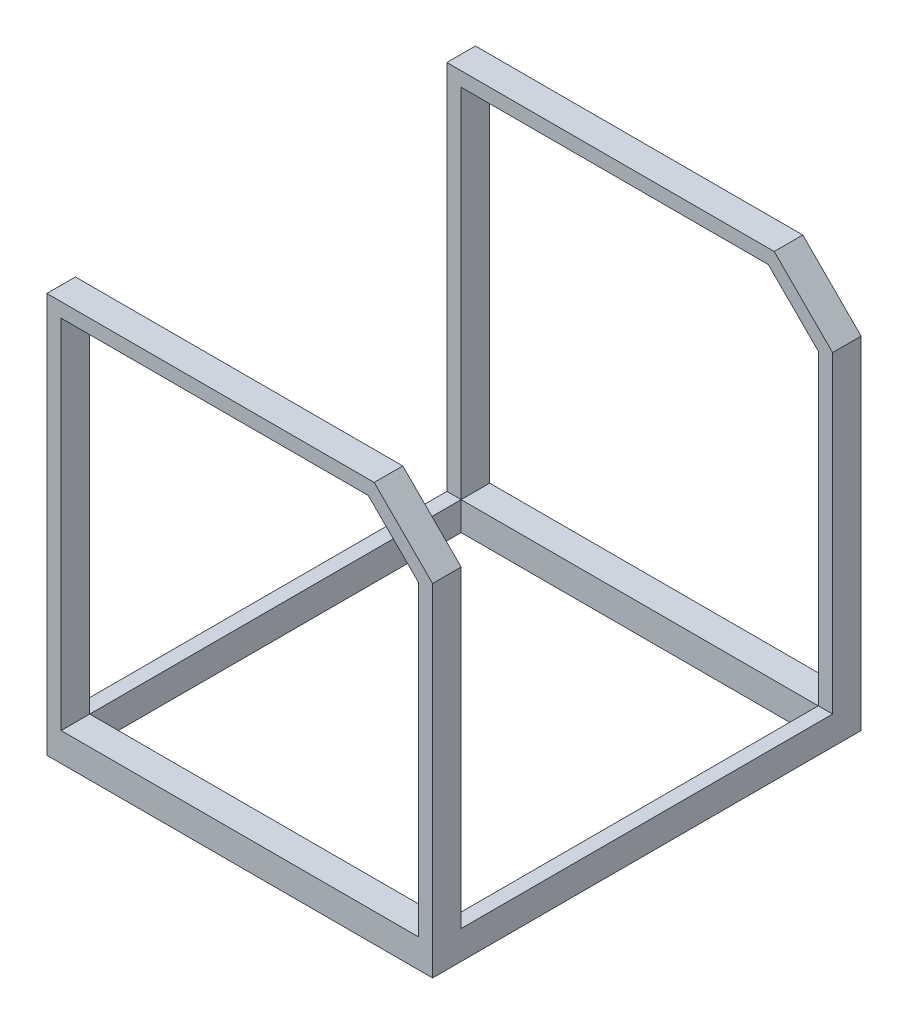
ISO-10303-21;
HEADER;
FILE_DESCRIPTION(('STEP AP214'),'2;1');
FILE_NAME('part.step','',(''),(''),'','','');
FILE_SCHEMA(('AUTOMOTIVE_DESIGN { 1 0 10303 214 1 1 1 1 }'));
ENDSEC;
DATA;
#1=APPLICATION_CONTEXT('core data for automotive mechanical design processes');
#2=APPLICATION_PROTOCOL_DEFINITION('international standard','automotive_design',2000,#1);
#3=PRODUCT_CONTEXT('',#1,'mechanical');
#4=PRODUCT('Part','Part','',(#3));
#5=PRODUCT_RELATED_PRODUCT_CATEGORY('part','',(#4));
#6=PRODUCT_DEFINITION_FORMATION('','',#4);
#7=PRODUCT_DEFINITION_CONTEXT('part definition',#1,'design');
#8=PRODUCT_DEFINITION('design','',#6,#7);
#9=PRODUCT_DEFINITION_SHAPE('','',#8);
#10=(LENGTH_UNIT() NAMED_UNIT(*) SI_UNIT(.MILLI.,.METRE.));
#11=(NAMED_UNIT(*) PLANE_ANGLE_UNIT() SI_UNIT($,.RADIAN.));
#12=(NAMED_UNIT(*) SI_UNIT($,.STERADIAN.) SOLID_ANGLE_UNIT());
#13=UNCERTAINTY_MEASURE_WITH_UNIT(LENGTH_MEASURE(1.E-05),#10,'distance_accuracy_value','');
#14=(GEOMETRIC_REPRESENTATION_CONTEXT(3) GLOBAL_UNCERTAINTY_ASSIGNED_CONTEXT((#13)) GLOBAL_UNIT_ASSIGNED_CONTEXT((#10,
#11,#12)) REPRESENTATION_CONTEXT('',''));
#15=CARTESIAN_POINT('',(0.,0.,0.));
#16=DIRECTION('',(0.,0.,1.));
#17=DIRECTION('',(1.,0.,0.));
#18=AXIS2_PLACEMENT_3D('',#15,#16,#17);
#19=CARTESIAN_POINT('',(0.,0.,40.));
#20=DIRECTION('',(0.,0.,-1.));
#21=DIRECTION('',(-1.,0.,0.));
#22=AXIS2_PLACEMENT_3D('',#19,#20,#21);
#23=PLANE('',#22);
#24=DIRECTION('',(0.,1.,0.));
#25=VECTOR('',#24,1.);
#26=CARTESIAN_POINT('',(20.,0.,40.));
#27=LINE('',#26,#25);
#28=CARTESIAN_POINT('',(20.,0.,40.));
#29=VERTEX_POINT('',#28);
#30=CARTESIAN_POINT('',(20.,39.9999999999999,40.));
#31=VERTEX_POINT('',#30);
#32=EDGE_CURVE('E47',#29,#31,#27,.T.);
#33=ORIENTED_EDGE('',*,*,#32,.F.);
#34=DIRECTION('',(1.,0.,0.));
#35=VECTOR('',#34,1.);
#36=CARTESIAN_POINT('',(540.,0.,40.));
#37=LINE('',#36,#35);
#38=CARTESIAN_POINT('',(520.,0.,40.));
#39=VERTEX_POINT('',#38);
#40=EDGE_CURVE('E347',#29,#39,#37,.T.);
#41=ORIENTED_EDGE('',*,*,#40,.T.);
#42=DIRECTION('',(0.,-1.,0.));
#43=VECTOR('',#42,1.);
#44=CARTESIAN_POINT('',(520.,0.,40.));
#45=LINE('',#44,#43);
#46=CARTESIAN_POINT('',(520.,40.,40.));
#47=VERTEX_POINT('',#46);
#48=EDGE_CURVE('E290',#47,#39,#45,.T.);
#49=ORIENTED_EDGE('',*,*,#48,.F.);
#50=DIRECTION('',(1.,0.,0.));
#51=VECTOR('',#50,1.);
#52=CARTESIAN_POINT('',(520.,40.,40.));
#53=LINE('',#52,#51);
#54=EDGE_CURVE('E307',#31,#47,#53,.T.);
#55=ORIENTED_EDGE('',*,*,#54,.F.);
#56=EDGE_LOOP('',(#33,#41,#49,#55));
#57=FACE_BOUND('',#56,.T.);
#58=ADVANCED_FACE('F32',(#57),#23,.F.);
#59=DIRECTION('',(-1.,0.,0.));
#60=VECTOR('',#59,1.);
#61=CARTESIAN_POINT('',(0.,39.9999999999999,40.));
#62=LINE('',#61,#60);
#63=CARTESIAN_POINT('',(0.,39.9999999999999,40.));
#64=VERTEX_POINT('',#63);
#65=EDGE_CURVE('E272',#31,#64,#62,.T.);
#66=ORIENTED_EDGE('',*,*,#65,.F.);
#67=DIRECTION('',(0.,-1.,0.));
#68=VECTOR('',#67,1.);
#69=CARTESIAN_POINT('',(20.,39.9999999999999,40.));
#70=LINE('',#69,#68);
#71=CARTESIAN_POINT('',(20.,540.,40.));
#72=VERTEX_POINT('',#71);
#73=EDGE_CURVE('E318',#72,#31,#70,.T.);
#74=ORIENTED_EDGE('',*,*,#73,.F.);
#75=DIRECTION('',(-1.,0.,0.));
#76=VECTOR('',#75,1.);
#77=CARTESIAN_POINT('',(20.,540.,40.));
#78=LINE('',#77,#76);
#79=CARTESIAN_POINT('',(450.,540.,40.));
#80=VERTEX_POINT('',#79);
#81=EDGE_CURVE('E315',#80,#72,#78,.T.);
#82=ORIENTED_EDGE('',*,*,#81,.F.);
#83=DIRECTION('',(-0.707106781186548,0.707106781186548,0.));
#84=VECTOR('',#83,1.);
#85=CARTESIAN_POINT('',(450.,540.,40.));
#86=LINE('',#85,#84);
#87=CARTESIAN_POINT('',(520.,470.,40.));
#88=VERTEX_POINT('',#87);
#89=EDGE_CURVE('E313',#88,#80,#86,.T.);
#90=ORIENTED_EDGE('',*,*,#89,.F.);
#91=DIRECTION('',(0.,1.,0.));
#92=VECTOR('',#91,1.);
#93=CARTESIAN_POINT('',(520.,470.,40.));
#94=LINE('',#93,#92);
#95=EDGE_CURVE('E310',#47,#88,#94,.T.);
#96=ORIENTED_EDGE('',*,*,#95,.F.);
#97=DIRECTION('',(-1.,0.,0.));
#98=VECTOR('',#97,1.);
#99=CARTESIAN_POINT('',(540.,40.,40.));
#100=LINE('',#99,#98);
#101=CARTESIAN_POINT('',(540.,40.0000000000001,40.));
#102=VERTEX_POINT('',#101);
#103=EDGE_CURVE('E285',#102,#47,#100,.T.);
#104=ORIENTED_EDGE('',*,*,#103,.F.);
#105=DIRECTION('',(0.,1.,0.));
#106=VECTOR('',#105,1.);
#107=CARTESIAN_POINT('',(540.,478.284271247462,40.));
#108=LINE('',#107,#106);
#109=CARTESIAN_POINT('',(540.,478.284271247462,40.));
#110=VERTEX_POINT('',#109);
#111=EDGE_CURVE('E349',#102,#110,#108,.T.);
#112=ORIENTED_EDGE('',*,*,#111,.T.);
#113=DIRECTION('',(-0.707106781186547,0.707106781186548,0.));
#114=VECTOR('',#113,1.);
#115=CARTESIAN_POINT('',(458.284271247462,560.,40.));
#116=LINE('',#115,#114);
#117=CARTESIAN_POINT('',(458.284271247462,560.,40.));
#118=VERTEX_POINT('',#117);
#119=EDGE_CURVE('E352',#110,#118,#116,.T.);
#120=ORIENTED_EDGE('',*,*,#119,.T.);
#121=DIRECTION('',(-1.,0.,0.));
#122=VECTOR('',#121,1.);
#123=CARTESIAN_POINT('',(0.,560.,40.));
#124=LINE('',#123,#122);
#125=CARTESIAN_POINT('',(0.,560.,40.));
#126=VERTEX_POINT('',#125);
#127=EDGE_CURVE('E354',#118,#126,#124,.T.);
#128=ORIENTED_EDGE('',*,*,#127,.T.);
#129=DIRECTION('',(0.,-1.,0.));
#130=VECTOR('',#129,1.);
#131=CARTESIAN_POINT('',(0.,0.,40.));
#132=LINE('',#131,#130);
#133=EDGE_CURVE('E55',#126,#64,#132,.T.);
#134=ORIENTED_EDGE('',*,*,#133,.T.);
#135=EDGE_LOOP('',(#66,#74,#82,#90,#96,#104,#112,#120,#128,#134));
#136=FACE_BOUND('',#135,.T.);
#137=ADVANCED_FACE('F435',(#136),#23,.F.);
#138=CARTESIAN_POINT('',(0.,0.,0.));
#139=DIRECTION('',(0.,0.,-1.));
#140=DIRECTION('',(-1.,0.,0.));
#141=AXIS2_PLACEMENT_3D('',#138,#139,#140);
#142=PLANE('',#141);
#143=DIRECTION('',(1.,0.,0.));
#144=VECTOR('',#143,1.);
#145=CARTESIAN_POINT('',(540.,0.,0.));
#146=LINE('',#145,#144);
#147=CARTESIAN_POINT('',(0.,0.,0.));
#148=VERTEX_POINT('',#147);
#149=CARTESIAN_POINT('',(540.,0.,0.));
#150=VERTEX_POINT('',#149);
#151=EDGE_CURVE('E346',#148,#150,#146,.T.);
#152=ORIENTED_EDGE('',*,*,#151,.F.);
#153=DIRECTION('',(0.,-1.,0.));
#154=VECTOR('',#153,1.);
#155=CARTESIAN_POINT('',(0.,0.,0.));
#156=LINE('',#155,#154);
#157=CARTESIAN_POINT('',(0.,560.,0.));
#158=VERTEX_POINT('',#157);
#159=EDGE_CURVE('E350',#158,#148,#156,.T.);
#160=ORIENTED_EDGE('',*,*,#159,.F.);
#161=DIRECTION('',(-1.,0.,0.));
#162=VECTOR('',#161,1.);
#163=CARTESIAN_POINT('',(0.,560.,0.));
#164=LINE('',#163,#162);
#165=CARTESIAN_POINT('',(458.284271247462,560.,0.));
#166=VERTEX_POINT('',#165);
#167=EDGE_CURVE('E364',#166,#158,#164,.T.);
#168=ORIENTED_EDGE('',*,*,#167,.F.);
#169=DIRECTION('',(-0.707106781186547,0.707106781186548,0.));
#170=VECTOR('',#169,1.);
#171=CARTESIAN_POINT('',(458.284271247462,560.,0.));
#172=LINE('',#171,#170);
#173=CARTESIAN_POINT('',(540.,478.284271247462,0.));
#174=VERTEX_POINT('',#173);
#175=EDGE_CURVE('E362',#174,#166,#172,.T.);
#176=ORIENTED_EDGE('',*,*,#175,.F.);
#177=DIRECTION('',(0.,1.,0.));
#178=VECTOR('',#177,1.);
#179=CARTESIAN_POINT('',(540.,478.284271247462,0.));
#180=LINE('',#179,#178);
#181=EDGE_CURVE('E360',#150,#174,#180,.T.);
#182=ORIENTED_EDGE('',*,*,#181,.F.);
#183=EDGE_LOOP('',(#152,#160,#168,#176,#182));
#184=FACE_BOUND('',#183,.T.);
#185=DIRECTION('',(0.,-1.,0.));
#186=VECTOR('',#185,1.);
#187=CARTESIAN_POINT('',(20.,39.9999999999999,0.));
#188=LINE('',#187,#186);
#189=CARTESIAN_POINT('',(20.,540.,0.));
#190=VERTEX_POINT('',#189);
#191=CARTESIAN_POINT('',(20.,39.9999999999999,0.));
#192=VERTEX_POINT('',#191);
#193=EDGE_CURVE('E311',#190,#192,#188,.T.);
#194=ORIENTED_EDGE('',*,*,#193,.T.);
#195=DIRECTION('',(1.,0.,0.));
#196=VECTOR('',#195,1.);
#197=CARTESIAN_POINT('',(520.,40.,0.));
#198=LINE('',#197,#196);
#199=CARTESIAN_POINT('',(520.,40.,0.));
#200=VERTEX_POINT('',#199);
#201=EDGE_CURVE('E306',#192,#200,#198,.T.);
#202=ORIENTED_EDGE('',*,*,#201,.T.);
#203=DIRECTION('',(0.,1.,0.));
#204=VECTOR('',#203,1.);
#205=CARTESIAN_POINT('',(520.,470.,0.));
#206=LINE('',#205,#204);
#207=CARTESIAN_POINT('',(520.,470.,0.));
#208=VERTEX_POINT('',#207);
#209=EDGE_CURVE('E324',#200,#208,#206,.T.);
#210=ORIENTED_EDGE('',*,*,#209,.T.);
#211=DIRECTION('',(-0.707106781186548,0.707106781186548,0.));
#212=VECTOR('',#211,1.);
#213=CARTESIAN_POINT('',(450.,540.,0.));
#214=LINE('',#213,#212);
#215=CARTESIAN_POINT('',(450.,540.,0.));
#216=VERTEX_POINT('',#215);
#217=EDGE_CURVE('E327',#208,#216,#214,.T.);
#218=ORIENTED_EDGE('',*,*,#217,.T.);
#219=DIRECTION('',(-1.,0.,0.));
#220=VECTOR('',#219,1.);
#221=CARTESIAN_POINT('',(20.,540.,0.));
#222=LINE('',#221,#220);
#223=EDGE_CURVE('E330',#216,#190,#222,.T.);
#224=ORIENTED_EDGE('',*,*,#223,.T.);
#225=EDGE_LOOP('',(#194,#202,#210,#218,#224));
#226=FACE_BOUND('',#225,.T.);
#227=ADVANCED_FACE('F386',(#184,#226),#142,.T.);
#228=CARTESIAN_POINT('',(540.,0.,40.));
#229=DIRECTION('',(0.,1.,0.));
#230=DIRECTION('',(-1.,0.,0.));
#231=AXIS2_PLACEMENT_3D('',#228,#229,#230);
#232=PLANE('',#231);
#233=DIRECTION('',(0.,0.,-1.));
#234=VECTOR('',#233,1.);
#235=CARTESIAN_POINT('',(540.,0.,40.));
#236=LINE('',#235,#234);
#237=CARTESIAN_POINT('',(540.,0.,600.));
#238=VERTEX_POINT('',#237);
#239=EDGE_CURVE('E11',#238,#150,#236,.T.);
#240=ORIENTED_EDGE('',*,*,#239,.F.);
#241=DIRECTION('',(1.,0.,0.));
#242=VECTOR('',#241,1.);
#243=CARTESIAN_POINT('',(540.,0.,600.));
#244=LINE('',#243,#242);
#245=CARTESIAN_POINT('',(0.,0.,600.));
#246=VERTEX_POINT('',#245);
#247=EDGE_CURVE('E233',#246,#238,#244,.T.);
#248=ORIENTED_EDGE('',*,*,#247,.F.);
#249=DIRECTION('',(0.,0.,-1.));
#250=VECTOR('',#249,1.);
#251=CARTESIAN_POINT('',(0.,0.,40.));
#252=LINE('',#251,#250);
#253=EDGE_CURVE('E357',#246,#148,#252,.T.);
#254=ORIENTED_EDGE('',*,*,#253,.T.);
#255=ORIENTED_EDGE('',*,*,#151,.T.);
#256=EDGE_LOOP('',(#240,#248,#254,#255));
#257=FACE_BOUND('',#256,.T.);
#258=DIRECTION('',(1.,0.,0.));
#259=VECTOR('',#258,1.);
#260=CARTESIAN_POINT('',(540.,0.,560.));
#261=LINE('',#260,#259);
#262=CARTESIAN_POINT('',(20.,0.,560.));
#263=VERTEX_POINT('',#262);
#264=CARTESIAN_POINT('',(520.,0.,560.));
#265=VERTEX_POINT('',#264);
#266=EDGE_CURVE('E234',#263,#265,#261,.T.);
#267=ORIENTED_EDGE('',*,*,#266,.T.);
#268=DIRECTION('',(0.,0.,-1.));
#269=VECTOR('',#268,1.);
#270=CARTESIAN_POINT('',(520.,0.,560.));
#271=LINE('',#270,#269);
#272=EDGE_CURVE('E293',#265,#39,#271,.T.);
#273=ORIENTED_EDGE('',*,*,#272,.T.);
#274=ORIENTED_EDGE('',*,*,#40,.F.);
#275=DIRECTION('',(0.,0.,-1.));
#276=VECTOR('',#275,1.);
#277=CARTESIAN_POINT('',(20.,0.,560.));
#278=LINE('',#277,#276);
#279=EDGE_CURVE('E282',#263,#29,#278,.T.);
#280=ORIENTED_EDGE('',*,*,#279,.F.);
#281=EDGE_LOOP('',(#267,#273,#274,#280));
#282=FACE_BOUND('',#281,.T.);
#283=ADVANCED_FACE('F34',(#257,#282),#232,.F.);
#284=CARTESIAN_POINT('',(540.,478.284271247462,40.));
#285=DIRECTION('',(-1.,0.,0.));
#286=DIRECTION('',(0.,-1.,0.));
#287=AXIS2_PLACEMENT_3D('',#284,#285,#286);
#288=PLANE('',#287);
#289=ORIENTED_EDGE('',*,*,#181,.T.);
#290=DIRECTION('',(0.,0.,-1.));
#291=VECTOR('',#290,1.);
#292=CARTESIAN_POINT('',(540.,478.284271247462,40.));
#293=LINE('',#292,#291);
#294=EDGE_CURVE('E40',#110,#174,#293,.T.);
#295=ORIENTED_EDGE('',*,*,#294,.F.);
#296=ORIENTED_EDGE('',*,*,#111,.F.);
#297=DIRECTION('',(0.,0.,-1.));
#298=VECTOR('',#297,1.);
#299=CARTESIAN_POINT('',(540.,40.,560.));
#300=LINE('',#299,#298);
#301=CARTESIAN_POINT('',(540.,40.0000000000001,560.));
#302=VERTEX_POINT('',#301);
#303=EDGE_CURVE('E303',#302,#102,#300,.T.);
#304=ORIENTED_EDGE('',*,*,#303,.F.);
#305=DIRECTION('',(0.,1.,0.));
#306=VECTOR('',#305,1.);
#307=CARTESIAN_POINT('',(540.,478.284271247462,560.));
#308=LINE('',#307,#306);
#309=CARTESIAN_POINT('',(540.,478.284271247462,560.));
#310=VERTEX_POINT('',#309);
#311=EDGE_CURVE('E247',#302,#310,#308,.T.);
#312=ORIENTED_EDGE('',*,*,#311,.T.);
#313=DIRECTION('',(0.,0.,1.));
#314=VECTOR('',#313,1.);
#315=CARTESIAN_POINT('',(540.,478.284271247462,560.));
#316=LINE('',#315,#314);
#317=CARTESIAN_POINT('',(540.,478.284271247462,600.));
#318=VERTEX_POINT('',#317);
#319=EDGE_CURVE('E249',#310,#318,#316,.T.);
#320=ORIENTED_EDGE('',*,*,#319,.T.);
#321=DIRECTION('',(0.,1.,0.));
#322=VECTOR('',#321,1.);
#323=CARTESIAN_POINT('',(540.,478.284271247462,600.));
#324=LINE('',#323,#322);
#325=EDGE_CURVE('E238',#238,#318,#324,.T.);
#326=ORIENTED_EDGE('',*,*,#325,.F.);
#327=ORIENTED_EDGE('',*,*,#239,.T.);
#328=EDGE_LOOP('',(#289,#295,#296,#304,#312,#320,#326,#327));
#329=FACE_BOUND('',#328,.T.);
#330=ADVANCED_FACE('F411',(#329),#288,.F.);
#331=CARTESIAN_POINT('',(458.284271247462,560.,40.));
#332=DIRECTION('',(-0.707106781186548,-0.707106781186547,0.));
#333=DIRECTION('',(0.707106781186547,-0.707106781186548,0.));
#334=AXIS2_PLACEMENT_3D('',#331,#332,#333);
#335=PLANE('',#334);
#336=ORIENTED_EDGE('',*,*,#175,.T.);
#337=DIRECTION('',(0.,0.,-1.));
#338=VECTOR('',#337,1.);
#339=CARTESIAN_POINT('',(458.284271247462,560.,40.));
#340=LINE('',#339,#338);
#341=EDGE_CURVE('E372',#118,#166,#340,.T.);
#342=ORIENTED_EDGE('',*,*,#341,.F.);
#343=ORIENTED_EDGE('',*,*,#119,.F.);
#344=ORIENTED_EDGE('',*,*,#294,.T.);
#345=EDGE_LOOP('',(#336,#342,#343,#344));
#346=FACE_BOUND('',#345,.T.);
#347=ADVANCED_FACE('F379',(#346),#335,.F.);
#348=CARTESIAN_POINT('',(0.,560.,40.));
#349=DIRECTION('',(0.,-1.,0.));
#350=DIRECTION('',(0.,0.,-1.));
#351=AXIS2_PLACEMENT_3D('',#348,#349,#350);
#352=PLANE('',#351);
#353=ORIENTED_EDGE('',*,*,#167,.T.);
#354=DIRECTION('',(0.,0.,-1.));
#355=VECTOR('',#354,1.);
#356=CARTESIAN_POINT('',(0.,560.,40.));
#357=LINE('',#356,#355);
#358=EDGE_CURVE('E369',#126,#158,#357,.T.);
#359=ORIENTED_EDGE('',*,*,#358,.F.);
#360=ORIENTED_EDGE('',*,*,#127,.F.);
#361=ORIENTED_EDGE('',*,*,#341,.T.);
#362=EDGE_LOOP('',(#353,#359,#360,#361));
#363=FACE_BOUND('',#362,.T.);
#364=ADVANCED_FACE('F391',(#363),#352,.F.);
#365=CARTESIAN_POINT('',(0.,0.,40.));
#366=DIRECTION('',(1.,0.,0.));
#367=DIRECTION('',(0.,0.,-1.));
#368=AXIS2_PLACEMENT_3D('',#365,#366,#367);
#369=PLANE('',#368);
#370=ORIENTED_EDGE('',*,*,#159,.T.);
#371=ORIENTED_EDGE('',*,*,#253,.F.);
#372=DIRECTION('',(0.,-1.,0.));
#373=VECTOR('',#372,1.);
#374=CARTESIAN_POINT('',(0.,0.,600.));
#375=LINE('',#374,#373);
#376=CARTESIAN_POINT('',(0.,560.,600.));
#377=VERTEX_POINT('',#376);
#378=EDGE_CURVE('E252',#377,#246,#375,.T.);
#379=ORIENTED_EDGE('',*,*,#378,.F.);
#380=DIRECTION('',(0.,0.,1.));
#381=VECTOR('',#380,1.);
#382=CARTESIAN_POINT('',(0.,560.,560.));
#383=LINE('',#382,#381);
#384=CARTESIAN_POINT('',(0.,560.,560.));
#385=VERTEX_POINT('',#384);
#386=EDGE_CURVE('E266',#385,#377,#383,.T.);
#387=ORIENTED_EDGE('',*,*,#386,.F.);
#388=DIRECTION('',(0.,-1.,0.));
#389=VECTOR('',#388,1.);
#390=CARTESIAN_POINT('',(0.,0.,560.));
#391=LINE('',#390,#389);
#392=CARTESIAN_POINT('',(0.,39.9999999999999,560.));
#393=VERTEX_POINT('',#392);
#394=EDGE_CURVE('E237',#385,#393,#391,.T.);
#395=ORIENTED_EDGE('',*,*,#394,.T.);
#396=DIRECTION('',(0.,0.,-1.));
#397=VECTOR('',#396,1.);
#398=CARTESIAN_POINT('',(0.,39.9999999999999,560.));
#399=LINE('',#398,#397);
#400=EDGE_CURVE('E274',#393,#64,#399,.T.);
#401=ORIENTED_EDGE('',*,*,#400,.T.);
#402=ORIENTED_EDGE('',*,*,#133,.F.);
#403=ORIENTED_EDGE('',*,*,#358,.T.);
#404=EDGE_LOOP('',(#370,#371,#379,#387,#395,#401,#402,#403));
#405=FACE_BOUND('',#404,.T.);
#406=ADVANCED_FACE('F394',(#405),#369,.F.);
#407=CARTESIAN_POINT('',(520.,40.,40.));
#408=DIRECTION('',(0.,1.,0.));
#409=DIRECTION('',(-1.,0.,0.));
#410=AXIS2_PLACEMENT_3D('',#407,#408,#409);
#411=PLANE('',#410);
#412=ORIENTED_EDGE('',*,*,#201,.F.);
#413=DIRECTION('',(0.,0.,-1.));
#414=VECTOR('',#413,1.);
#415=CARTESIAN_POINT('',(20.,39.9999999999999,40.));
#416=LINE('',#415,#414);
#417=EDGE_CURVE('E321',#31,#192,#416,.T.);
#418=ORIENTED_EDGE('',*,*,#417,.F.);
#419=ORIENTED_EDGE('',*,*,#54,.T.);
#420=DIRECTION('',(0.,0.,-1.));
#421=VECTOR('',#420,1.);
#422=CARTESIAN_POINT('',(520.,40.,40.));
#423=LINE('',#422,#421);
#424=EDGE_CURVE('E343',#47,#200,#423,.T.);
#425=ORIENTED_EDGE('',*,*,#424,.T.);
#426=EDGE_LOOP('',(#412,#418,#419,#425));
#427=FACE_BOUND('',#426,.T.);
#428=ADVANCED_FACE('F442',(#427),#411,.T.);
#429=CARTESIAN_POINT('',(520.,470.,40.));
#430=DIRECTION('',(-1.,0.,0.));
#431=DIRECTION('',(0.,-1.,0.));
#432=AXIS2_PLACEMENT_3D('',#429,#430,#431);
#433=PLANE('',#432);
#434=ORIENTED_EDGE('',*,*,#209,.F.);
#435=ORIENTED_EDGE('',*,*,#424,.F.);
#436=ORIENTED_EDGE('',*,*,#95,.T.);
#437=DIRECTION('',(0.,0.,-1.));
#438=VECTOR('',#437,1.);
#439=CARTESIAN_POINT('',(520.,470.,40.));
#440=LINE('',#439,#438);
#441=EDGE_CURVE('E341',#88,#208,#440,.T.);
#442=ORIENTED_EDGE('',*,*,#441,.T.);
#443=EDGE_LOOP('',(#434,#435,#436,#442));
#444=FACE_BOUND('',#443,.T.);
#445=ADVANCED_FACE('F546',(#444),#433,.T.);
#446=CARTESIAN_POINT('',(450.,540.,40.));
#447=DIRECTION('',(-0.707106781186548,-0.707106781186548,0.));
#448=DIRECTION('',(0.707106781186548,-0.707106781186548,0.));
#449=AXIS2_PLACEMENT_3D('',#446,#447,#448);
#450=PLANE('',#449);
#451=ORIENTED_EDGE('',*,*,#217,.F.);
#452=ORIENTED_EDGE('',*,*,#441,.F.);
#453=ORIENTED_EDGE('',*,*,#89,.T.);
#454=DIRECTION('',(0.,0.,-1.));
#455=VECTOR('',#454,1.);
#456=CARTESIAN_POINT('',(450.,540.,40.));
#457=LINE('',#456,#455);
#458=EDGE_CURVE('E339',#80,#216,#457,.T.);
#459=ORIENTED_EDGE('',*,*,#458,.T.);
#460=EDGE_LOOP('',(#451,#452,#453,#459));
#461=FACE_BOUND('',#460,.T.);
#462=ADVANCED_FACE('F566',(#461),#450,.T.);
#463=CARTESIAN_POINT('',(20.,540.,40.));
#464=DIRECTION('',(0.,-1.,0.));
#465=DIRECTION('',(0.,0.,-1.));
#466=AXIS2_PLACEMENT_3D('',#463,#464,#465);
#467=PLANE('',#466);
#468=ORIENTED_EDGE('',*,*,#223,.F.);
#469=ORIENTED_EDGE('',*,*,#458,.F.);
#470=ORIENTED_EDGE('',*,*,#81,.T.);
#471=DIRECTION('',(0.,0.,-1.));
#472=VECTOR('',#471,1.);
#473=CARTESIAN_POINT('',(20.,540.,40.));
#474=LINE('',#473,#472);
#475=EDGE_CURVE('E337',#72,#190,#474,.T.);
#476=ORIENTED_EDGE('',*,*,#475,.T.);
#477=EDGE_LOOP('',(#468,#469,#470,#476));
#478=FACE_BOUND('',#477,.T.);
#479=ADVANCED_FACE('F534',(#478),#467,.T.);
#480=CARTESIAN_POINT('',(20.,39.9999999999999,40.));
#481=DIRECTION('',(1.,0.,0.));
#482=DIRECTION('',(0.,1.,0.));
#483=AXIS2_PLACEMENT_3D('',#480,#481,#482);
#484=PLANE('',#483);
#485=ORIENTED_EDGE('',*,*,#193,.F.);
#486=ORIENTED_EDGE('',*,*,#475,.F.);
#487=ORIENTED_EDGE('',*,*,#73,.T.);
#488=ORIENTED_EDGE('',*,*,#417,.T.);
#489=EDGE_LOOP('',(#485,#486,#487,#488));
#490=FACE_BOUND('',#489,.T.);
#491=ADVANCED_FACE('F508',(#490),#484,.T.);
#492=CARTESIAN_POINT('',(540.,40.,560.));
#493=DIRECTION('',(0.,-1.,0.));
#494=DIRECTION('',(0.,0.,-1.));
#495=AXIS2_PLACEMENT_3D('',#492,#493,#494);
#496=PLANE('',#495);
#497=ORIENTED_EDGE('',*,*,#103,.T.);
#498=DIRECTION('',(0.,0.,-1.));
#499=VECTOR('',#498,1.);
#500=CARTESIAN_POINT('',(520.,40.,560.));
#501=LINE('',#500,#499);
#502=CARTESIAN_POINT('',(520.,40.,560.));
#503=VERTEX_POINT('',#502);
#504=EDGE_CURVE('E300',#503,#47,#501,.T.);
#505=ORIENTED_EDGE('',*,*,#504,.F.);
#506=DIRECTION('',(-1.,0.,0.));
#507=VECTOR('',#506,1.);
#508=CARTESIAN_POINT('',(540.,40.,560.));
#509=LINE('',#508,#507);
#510=EDGE_CURVE('E286',#302,#503,#509,.T.);
#511=ORIENTED_EDGE('',*,*,#510,.F.);
#512=ORIENTED_EDGE('',*,*,#303,.T.);
#513=EDGE_LOOP('',(#497,#505,#511,#512));
#514=FACE_BOUND('',#513,.T.);
#515=ADVANCED_FACE('F414',(#514),#496,.F.);
#516=CARTESIAN_POINT('',(520.,0.,560.));
#517=DIRECTION('',(1.,0.,0.));
#518=DIRECTION('',(0.,0.,-1.));
#519=AXIS2_PLACEMENT_3D('',#516,#517,#518);
#520=PLANE('',#519);
#521=ORIENTED_EDGE('',*,*,#48,.T.);
#522=ORIENTED_EDGE('',*,*,#272,.F.);
#523=DIRECTION('',(0.,-1.,0.));
#524=VECTOR('',#523,1.);
#525=CARTESIAN_POINT('',(520.,0.,560.));
#526=LINE('',#525,#524);
#527=EDGE_CURVE('E289',#503,#265,#526,.T.);
#528=ORIENTED_EDGE('',*,*,#527,.F.);
#529=ORIENTED_EDGE('',*,*,#504,.T.);
#530=EDGE_LOOP('',(#521,#522,#528,#529));
#531=FACE_BOUND('',#530,.T.);
#532=ADVANCED_FACE('F417',(#531),#520,.F.);
#533=CARTESIAN_POINT('',(20.,0.,560.));
#534=DIRECTION('',(-1.,0.,0.));
#535=DIRECTION('',(0.,0.,1.));
#536=AXIS2_PLACEMENT_3D('',#533,#534,#535);
#537=PLANE('',#536);
#538=ORIENTED_EDGE('',*,*,#32,.T.);
#539=DIRECTION('',(0.,0.,-1.));
#540=VECTOR('',#539,1.);
#541=CARTESIAN_POINT('',(20.,39.9999999999999,560.));
#542=LINE('',#541,#540);
#543=CARTESIAN_POINT('',(20.,39.9999999999999,560.));
#544=VERTEX_POINT('',#543);
#545=EDGE_CURVE('E279',#544,#31,#542,.T.);
#546=ORIENTED_EDGE('',*,*,#545,.F.);
#547=DIRECTION('',(0.,1.,0.));
#548=VECTOR('',#547,1.);
#549=CARTESIAN_POINT('',(20.,0.,560.));
#550=LINE('',#549,#548);
#551=EDGE_CURVE('E268',#263,#544,#550,.T.);
#552=ORIENTED_EDGE('',*,*,#551,.F.);
#553=ORIENTED_EDGE('',*,*,#279,.T.);
#554=EDGE_LOOP('',(#538,#546,#552,#553));
#555=FACE_BOUND('',#554,.T.);
#556=ADVANCED_FACE('F425',(#555),#537,.F.);
#557=CARTESIAN_POINT('',(0.,39.9999999999999,560.));
#558=DIRECTION('',(0.,-1.,0.));
#559=DIRECTION('',(0.,0.,-1.));
#560=AXIS2_PLACEMENT_3D('',#557,#558,#559);
#561=PLANE('',#560);
#562=ORIENTED_EDGE('',*,*,#65,.T.);
#563=ORIENTED_EDGE('',*,*,#400,.F.);
#564=DIRECTION('',(-1.,0.,0.));
#565=VECTOR('',#564,1.);
#566=CARTESIAN_POINT('',(0.,39.9999999999999,560.));
#567=LINE('',#566,#565);
#568=EDGE_CURVE('E271',#544,#393,#567,.T.);
#569=ORIENTED_EDGE('',*,*,#568,.F.);
#570=ORIENTED_EDGE('',*,*,#545,.T.);
#571=EDGE_LOOP('',(#562,#563,#569,#570));
#572=FACE_BOUND('',#571,.T.);
#573=ADVANCED_FACE('F398',(#572),#561,.F.);
#574=CARTESIAN_POINT('',(0.,0.,560.));
#575=DIRECTION('',(0.,0.,1.));
#576=DIRECTION('',(-1.,0.,0.));
#577=AXIS2_PLACEMENT_3D('',#574,#575,#576);
#578=PLANE('',#577);
#579=ORIENTED_EDGE('',*,*,#311,.F.);
#580=ORIENTED_EDGE('',*,*,#510,.T.);
#581=DIRECTION('',(0.,1.,0.));
#582=VECTOR('',#581,1.);
#583=CARTESIAN_POINT('',(520.,470.,560.));
#584=LINE('',#583,#582);
#585=CARTESIAN_POINT('',(520.,470.,560.));
#586=VERTEX_POINT('',#585);
#587=EDGE_CURVE('E210',#503,#586,#584,.T.);
#588=ORIENTED_EDGE('',*,*,#587,.T.);
#589=DIRECTION('',(-0.707106781186548,0.707106781186548,0.));
#590=VECTOR('',#589,1.);
#591=CARTESIAN_POINT('',(450.,540.,560.));
#592=LINE('',#591,#590);
#593=CARTESIAN_POINT('',(450.,540.,560.));
#594=VERTEX_POINT('',#593);
#595=EDGE_CURVE('E208',#586,#594,#592,.T.);
#596=ORIENTED_EDGE('',*,*,#595,.T.);
#597=DIRECTION('',(-1.,0.,0.));
#598=VECTOR('',#597,1.);
#599=CARTESIAN_POINT('',(20.,540.,560.));
#600=LINE('',#599,#598);
#601=CARTESIAN_POINT('',(20.,540.,560.));
#602=VERTEX_POINT('',#601);
#603=EDGE_CURVE('E186',#594,#602,#600,.T.);
#604=ORIENTED_EDGE('',*,*,#603,.T.);
#605=DIRECTION('',(0.,-1.,0.));
#606=VECTOR('',#605,1.);
#607=CARTESIAN_POINT('',(20.,39.9999999999999,560.));
#608=LINE('',#607,#606);
#609=EDGE_CURVE('E198',#602,#544,#608,.T.);
#610=ORIENTED_EDGE('',*,*,#609,.T.);
#611=ORIENTED_EDGE('',*,*,#568,.T.);
#612=ORIENTED_EDGE('',*,*,#394,.F.);
#613=DIRECTION('',(-1.,0.,0.));
#614=VECTOR('',#613,1.);
#615=CARTESIAN_POINT('',(0.,560.,560.));
#616=LINE('',#615,#614);
#617=CARTESIAN_POINT('',(458.284271247462,560.,560.));
#618=VERTEX_POINT('',#617);
#619=EDGE_CURVE('E241',#618,#385,#616,.T.);
#620=ORIENTED_EDGE('',*,*,#619,.F.);
#621=DIRECTION('',(-0.707106781186547,0.707106781186548,0.));
#622=VECTOR('',#621,1.);
#623=CARTESIAN_POINT('',(458.284271247462,560.,560.));
#624=LINE('',#623,#622);
#625=EDGE_CURVE('E244',#310,#618,#624,.T.);
#626=ORIENTED_EDGE('',*,*,#625,.F.);
#627=EDGE_LOOP('',(#579,#580,#588,#596,#604,#610,#611,#612,#620,#626));
#628=FACE_BOUND('',#627,.T.);
#629=ADVANCED_FACE('F206',(#628),#578,.F.);
#630=DIRECTION('',(1.,0.,0.));
#631=VECTOR('',#630,1.);
#632=CARTESIAN_POINT('',(520.,40.,560.));
#633=LINE('',#632,#631);
#634=EDGE_CURVE('E203',#544,#503,#633,.T.);
#635=ORIENTED_EDGE('',*,*,#634,.T.);
#636=ORIENTED_EDGE('',*,*,#527,.T.);
#637=ORIENTED_EDGE('',*,*,#266,.F.);
#638=ORIENTED_EDGE('',*,*,#551,.T.);
#639=EDGE_LOOP('',(#635,#636,#637,#638));
#640=FACE_BOUND('',#639,.T.);
#641=ADVANCED_FACE('F421',(#640),#578,.F.);
#642=CARTESIAN_POINT('',(0.,560.,560.));
#643=DIRECTION('',(0.,1.,0.));
#644=DIRECTION('',(0.,0.,1.));
#645=AXIS2_PLACEMENT_3D('',#642,#643,#644);
#646=PLANE('',#645);
#647=DIRECTION('',(-1.,0.,0.));
#648=VECTOR('',#647,1.);
#649=CARTESIAN_POINT('',(0.,560.,600.));
#650=LINE('',#649,#648);
#651=CARTESIAN_POINT('',(458.284271247462,560.,600.));
#652=VERTEX_POINT('',#651);
#653=EDGE_CURVE('E255',#652,#377,#650,.T.);
#654=ORIENTED_EDGE('',*,*,#653,.F.);
#655=DIRECTION('',(0.,0.,1.));
#656=VECTOR('',#655,1.);
#657=CARTESIAN_POINT('',(458.284271247462,560.,560.));
#658=LINE('',#657,#656);
#659=EDGE_CURVE('E264',#618,#652,#658,.T.);
#660=ORIENTED_EDGE('',*,*,#659,.F.);
#661=ORIENTED_EDGE('',*,*,#619,.T.);
#662=ORIENTED_EDGE('',*,*,#386,.T.);
#663=EDGE_LOOP('',(#654,#660,#661,#662));
#664=FACE_BOUND('',#663,.T.);
#665=ADVANCED_FACE('F403',(#664),#646,.T.);
#666=CARTESIAN_POINT('',(458.284271247462,560.,560.));
#667=DIRECTION('',(0.707106781186548,0.707106781186547,0.));
#668=DIRECTION('',(-0.707106781186547,0.707106781186548,0.));
#669=AXIS2_PLACEMENT_3D('',#666,#667,#668);
#670=PLANE('',#669);
#671=DIRECTION('',(-0.707106781186547,0.707106781186548,0.));
#672=VECTOR('',#671,1.);
#673=CARTESIAN_POINT('',(458.284271247462,560.,600.));
#674=LINE('',#673,#672);
#675=EDGE_CURVE('E258',#318,#652,#674,.T.);
#676=ORIENTED_EDGE('',*,*,#675,.F.);
#677=ORIENTED_EDGE('',*,*,#319,.F.);
#678=ORIENTED_EDGE('',*,*,#625,.T.);
#679=ORIENTED_EDGE('',*,*,#659,.T.);
#680=EDGE_LOOP('',(#676,#677,#678,#679));
#681=FACE_BOUND('',#680,.T.);
#682=ADVANCED_FACE('F407',(#681),#670,.T.);
#683=CARTESIAN_POINT('',(0.,0.,600.));
#684=DIRECTION('',(0.,0.,1.));
#685=DIRECTION('',(-1.,0.,0.));
#686=AXIS2_PLACEMENT_3D('',#683,#684,#685);
#687=PLANE('',#686);
#688=DIRECTION('',(1.,0.,0.));
#689=VECTOR('',#688,1.);
#690=CARTESIAN_POINT('',(520.,40.,600.));
#691=LINE('',#690,#689);
#692=CARTESIAN_POINT('',(20.,39.9999999999999,600.));
#693=VERTEX_POINT('',#692);
#694=CARTESIAN_POINT('',(520.,40.,600.));
#695=VERTEX_POINT('',#694);
#696=EDGE_CURVE('E216',#693,#695,#691,.T.);
#697=ORIENTED_EDGE('',*,*,#696,.F.);
#698=DIRECTION('',(0.,-1.,0.));
#699=VECTOR('',#698,1.);
#700=CARTESIAN_POINT('',(20.,39.9999999999999,600.));
#701=LINE('',#700,#699);
#702=CARTESIAN_POINT('',(20.,540.,600.));
#703=VERTEX_POINT('',#702);
#704=EDGE_CURVE('E218',#703,#693,#701,.T.);
#705=ORIENTED_EDGE('',*,*,#704,.F.);
#706=DIRECTION('',(-1.,0.,0.));
#707=VECTOR('',#706,1.);
#708=CARTESIAN_POINT('',(20.,540.,600.));
#709=LINE('',#708,#707);
#710=CARTESIAN_POINT('',(450.,540.,600.));
#711=VERTEX_POINT('',#710);
#712=EDGE_CURVE('E189',#711,#703,#709,.T.);
#713=ORIENTED_EDGE('',*,*,#712,.F.);
#714=DIRECTION('',(-0.707106781186548,0.707106781186548,0.));
#715=VECTOR('',#714,1.);
#716=CARTESIAN_POINT('',(450.,540.,600.));
#717=LINE('',#716,#715);
#718=CARTESIAN_POINT('',(520.,470.,600.));
#719=VERTEX_POINT('',#718);
#720=EDGE_CURVE('E221',#719,#711,#717,.T.);
#721=ORIENTED_EDGE('',*,*,#720,.F.);
#722=DIRECTION('',(0.,1.,0.));
#723=VECTOR('',#722,1.);
#724=CARTESIAN_POINT('',(520.,470.,600.));
#725=LINE('',#724,#723);
#726=EDGE_CURVE('E224',#695,#719,#725,.T.);
#727=ORIENTED_EDGE('',*,*,#726,.F.);
#728=EDGE_LOOP('',(#697,#705,#713,#721,#727));
#729=FACE_BOUND('',#728,.T.);
#730=ORIENTED_EDGE('',*,*,#247,.T.);
#731=ORIENTED_EDGE('',*,*,#325,.T.);
#732=ORIENTED_EDGE('',*,*,#675,.T.);
#733=ORIENTED_EDGE('',*,*,#653,.T.);
#734=ORIENTED_EDGE('',*,*,#378,.T.);
#735=EDGE_LOOP('',(#730,#731,#732,#733,#734));
#736=FACE_BOUND('',#735,.T.);
#737=ADVANCED_FACE('F460',(#729,#736),#687,.T.);
#738=CARTESIAN_POINT('',(520.,40.,560.));
#739=DIRECTION('',(0.,-1.,0.));
#740=DIRECTION('',(1.,0.,0.));
#741=AXIS2_PLACEMENT_3D('',#738,#739,#740);
#742=PLANE('',#741);
#743=ORIENTED_EDGE('',*,*,#696,.T.);
#744=DIRECTION('',(0.,0.,1.));
#745=VECTOR('',#744,1.);
#746=CARTESIAN_POINT('',(520.,40.,560.));
#747=LINE('',#746,#745);
#748=EDGE_CURVE('E215',#503,#695,#747,.T.);
#749=ORIENTED_EDGE('',*,*,#748,.F.);
#750=ORIENTED_EDGE('',*,*,#634,.F.);
#751=DIRECTION('',(0.,0.,1.));
#752=VECTOR('',#751,1.);
#753=CARTESIAN_POINT('',(20.,39.9999999999999,560.));
#754=LINE('',#753,#752);
#755=EDGE_CURVE('E193',#544,#693,#754,.T.);
#756=ORIENTED_EDGE('',*,*,#755,.T.);
#757=EDGE_LOOP('',(#743,#749,#750,#756));
#758=FACE_BOUND('',#757,.T.);
#759=ADVANCED_FACE('F462',(#758),#742,.F.);
#760=CARTESIAN_POINT('',(20.,39.9999999999999,560.));
#761=DIRECTION('',(-1.,0.,0.));
#762=DIRECTION('',(0.,-1.,0.));
#763=AXIS2_PLACEMENT_3D('',#760,#761,#762);
#764=PLANE('',#763);
#765=ORIENTED_EDGE('',*,*,#704,.T.);
#766=ORIENTED_EDGE('',*,*,#755,.F.);
#767=ORIENTED_EDGE('',*,*,#609,.F.);
#768=DIRECTION('',(0.,0.,1.));
#769=VECTOR('',#768,1.);
#770=CARTESIAN_POINT('',(20.,540.,560.));
#771=LINE('',#770,#769);
#772=EDGE_CURVE('E182',#602,#703,#771,.T.);
#773=ORIENTED_EDGE('',*,*,#772,.T.);
#774=EDGE_LOOP('',(#765,#766,#767,#773));
#775=FACE_BOUND('',#774,.T.);
#776=ADVANCED_FACE('F199',(#775),#764,.F.);
#777=CARTESIAN_POINT('',(20.,540.,560.));
#778=DIRECTION('',(0.,1.,0.));
#779=DIRECTION('',(0.,0.,1.));
#780=AXIS2_PLACEMENT_3D('',#777,#778,#779);
#781=PLANE('',#780);
#782=ORIENTED_EDGE('',*,*,#712,.T.);
#783=ORIENTED_EDGE('',*,*,#772,.F.);
#784=ORIENTED_EDGE('',*,*,#603,.F.);
#785=DIRECTION('',(0.,0.,1.));
#786=VECTOR('',#785,1.);
#787=CARTESIAN_POINT('',(450.,540.,560.));
#788=LINE('',#787,#786);
#789=EDGE_CURVE('E194',#594,#711,#788,.T.);
#790=ORIENTED_EDGE('',*,*,#789,.T.);
#791=EDGE_LOOP('',(#782,#783,#784,#790));
#792=FACE_BOUND('',#791,.T.);
#793=ADVANCED_FACE('F184',(#792),#781,.F.);
#794=CARTESIAN_POINT('',(450.,540.,560.));
#795=DIRECTION('',(0.707106781186548,0.707106781186548,0.));
#796=DIRECTION('',(-0.707106781186548,0.707106781186548,0.));
#797=AXIS2_PLACEMENT_3D('',#794,#795,#796);
#798=PLANE('',#797);
#799=ORIENTED_EDGE('',*,*,#720,.T.);
#800=ORIENTED_EDGE('',*,*,#789,.F.);
#801=ORIENTED_EDGE('',*,*,#595,.F.);
#802=DIRECTION('',(0.,0.,1.));
#803=VECTOR('',#802,1.);
#804=CARTESIAN_POINT('',(520.,470.,560.));
#805=LINE('',#804,#803);
#806=EDGE_CURVE('E229',#586,#719,#805,.T.);
#807=ORIENTED_EDGE('',*,*,#806,.T.);
#808=EDGE_LOOP('',(#799,#800,#801,#807));
#809=FACE_BOUND('',#808,.T.);
#810=ADVANCED_FACE('F668',(#809),#798,.F.);
#811=CARTESIAN_POINT('',(520.,470.,560.));
#812=DIRECTION('',(1.,0.,0.));
#813=DIRECTION('',(0.,1.,0.));
#814=AXIS2_PLACEMENT_3D('',#811,#812,#813);
#815=PLANE('',#814);
#816=ORIENTED_EDGE('',*,*,#726,.T.);
#817=ORIENTED_EDGE('',*,*,#806,.F.);
#818=ORIENTED_EDGE('',*,*,#587,.F.);
#819=ORIENTED_EDGE('',*,*,#748,.T.);
#820=EDGE_LOOP('',(#816,#817,#818,#819));
#821=FACE_BOUND('',#820,.T.);
#822=ADVANCED_FACE('F676',(#821),#815,.F.);
#823=CLOSED_SHELL('',(#58,#137,#227,#283,#330,#347,#364,#406,#428,#445,#462,#479,#491,#515,#532,
#556,#573,#629,#641,#665,#682,#737,#759,#776,#793,#810,#822));
#824=MANIFOLD_SOLID_BREP('B2',#823);
#825=ADVANCED_BREP_SHAPE_REPRESENTATION('',(#18,#824),#14);
#826=SHAPE_DEFINITION_REPRESENTATION(#9,#825);
ENDSEC;
END-ISO-10303-21;
